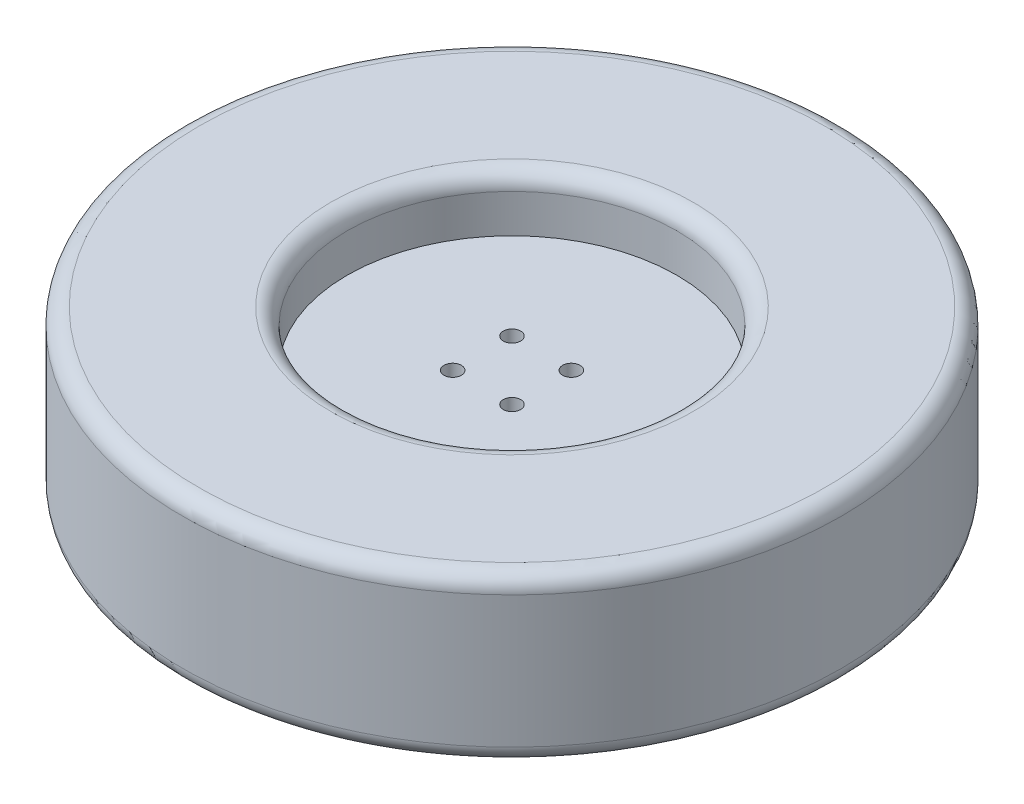
ISO-10303-21;
HEADER;
FILE_DESCRIPTION(('STEP AP214'),'2;1');
FILE_NAME('part.step','',(''),(''),'','','');
FILE_SCHEMA(('AUTOMOTIVE_DESIGN { 1 0 10303 214 1 1 1 1 }'));
ENDSEC;
DATA;
#1=APPLICATION_CONTEXT('core data for automotive mechanical design processes');
#2=APPLICATION_PROTOCOL_DEFINITION('international standard','automotive_design',2000,#1);
#3=PRODUCT_CONTEXT('',#1,'mechanical');
#4=PRODUCT('Part','Part','',(#3));
#5=PRODUCT_RELATED_PRODUCT_CATEGORY('part','',(#4));
#6=PRODUCT_DEFINITION_FORMATION('','',#4);
#7=PRODUCT_DEFINITION_CONTEXT('part definition',#1,'design');
#8=PRODUCT_DEFINITION('design','',#6,#7);
#9=PRODUCT_DEFINITION_SHAPE('','',#8);
#10=(LENGTH_UNIT() NAMED_UNIT(*) SI_UNIT(.MILLI.,.METRE.));
#11=(NAMED_UNIT(*) PLANE_ANGLE_UNIT() SI_UNIT($,.RADIAN.));
#12=(NAMED_UNIT(*) SI_UNIT($,.STERADIAN.) SOLID_ANGLE_UNIT());
#13=UNCERTAINTY_MEASURE_WITH_UNIT(LENGTH_MEASURE(1.E-05),#10,'distance_accuracy_value','');
#14=(GEOMETRIC_REPRESENTATION_CONTEXT(3) GLOBAL_UNCERTAINTY_ASSIGNED_CONTEXT((#13)) GLOBAL_UNIT_ASSIGNED_CONTEXT((#10,
#11,#12)) REPRESENTATION_CONTEXT('',''));
#15=CARTESIAN_POINT('',(0.,0.,0.));
#16=DIRECTION('',(0.,0.,1.));
#17=DIRECTION('',(1.,0.,0.));
#18=AXIS2_PLACEMENT_3D('',#15,#16,#17);
#19=CARTESIAN_POINT('',(0.,6.35,0.));
#20=DIRECTION('',(0.,1.,0.));
#21=DIRECTION('',(-1.,0.,0.));
#22=AXIS2_PLACEMENT_3D('',#19,#20,#21);
#23=CYLINDRICAL_SURFACE('',#22,38.1);
#24=CARTESIAN_POINT('',(0.,15.24,0.));
#25=DIRECTION('',(0.,1.,0.));
#26=DIRECTION('',(-1.,0.,0.));
#27=AXIS2_PLACEMENT_3D('',#24,#25,#26);
#28=CIRCLE('',#27,38.1);
#29=CARTESIAN_POINT('',(-38.1,15.24,0.));
#30=VERTEX_POINT('',#29);
#31=EDGE_CURVE('E64',#30,#30,#28,.T.);
#32=ORIENTED_EDGE('',*,*,#31,.T.);
#33=EDGE_LOOP('',(#32));
#34=FACE_BOUND('',#33,.T.);
#35=CARTESIAN_POINT('',(0.,6.35000000000001,0.));
#36=DIRECTION('',(0.,1.,0.));
#37=DIRECTION('',(-1.,0.,0.));
#38=AXIS2_PLACEMENT_3D('',#35,#36,#37);
#39=CIRCLE('',#38,38.1);
#40=CARTESIAN_POINT('',(-38.1,6.35,0.));
#41=VERTEX_POINT('',#40);
#42=EDGE_CURVE('E84',#41,#41,#39,.T.);
#43=ORIENTED_EDGE('',*,*,#42,.F.);
#44=EDGE_LOOP('',(#43));
#45=FACE_BOUND('',#44,.T.);
#46=ADVANCED_FACE('F40',(#34,#45),#23,.F.);
#47=CARTESIAN_POINT('',(-38.1,19.05,0.));
#48=DIRECTION('',(0.,1.,0.));
#49=DIRECTION('',(-1.,0.,0.));
#50=AXIS2_PLACEMENT_3D('',#47,#48,#49);
#51=PLANE('',#50);
#52=CARTESIAN_POINT('',(0.,19.05,0.));
#53=DIRECTION('',(0.,1.,0.));
#54=DIRECTION('',(-1.,0.,0.));
#55=AXIS2_PLACEMENT_3D('',#52,#53,#54);
#56=CIRCLE('',#55,41.91);
#57=CARTESIAN_POINT('',(-41.91,19.05,0.));
#58=VERTEX_POINT('',#57);
#59=EDGE_CURVE('E53',#58,#58,#56,.F.);
#60=ORIENTED_EDGE('',*,*,#59,.T.);
#61=EDGE_LOOP('',(#60));
#62=FACE_BOUND('',#61,.T.);
#63=CARTESIAN_POINT('',(0.,19.05,0.));
#64=DIRECTION('',(0.,1.,0.));
#65=DIRECTION('',(-1.,0.,0.));
#66=AXIS2_PLACEMENT_3D('',#63,#64,#65);
#67=CIRCLE('',#66,72.39);
#68=CARTESIAN_POINT('',(-72.39,19.05,0.));
#69=VERTEX_POINT('',#68);
#70=EDGE_CURVE('E58',#69,#69,#67,.T.);
#71=ORIENTED_EDGE('',*,*,#70,.T.);
#72=EDGE_LOOP('',(#71));
#73=FACE_BOUND('',#72,.T.);
#74=ADVANCED_FACE('F135',(#62,#73),#51,.T.);
#75=CARTESIAN_POINT('',(0.,6.35,0.));
#76=DIRECTION('',(0.,1.,0.));
#77=DIRECTION('',(-1.,0.,0.));
#78=AXIS2_PLACEMENT_3D('',#75,#76,#77);
#79=CYLINDRICAL_SURFACE('',#78,76.2);
#80=CARTESIAN_POINT('',(0.,-15.24,0.));
#81=DIRECTION('',(0.,-1.,0.));
#82=DIRECTION('',(1.,0.,0.));
#83=AXIS2_PLACEMENT_3D('',#80,#81,#82);
#84=CIRCLE('',#83,76.2);
#85=CARTESIAN_POINT('',(76.2,-15.24,0.));
#86=VERTEX_POINT('',#85);
#87=EDGE_CURVE('E10',#86,#86,#84,.F.);
#88=ORIENTED_EDGE('',*,*,#87,.T.);
#89=EDGE_LOOP('',(#88));
#90=FACE_BOUND('',#89,.T.);
#91=CARTESIAN_POINT('',(0.,15.24,0.));
#92=DIRECTION('',(0.,1.,0.));
#93=DIRECTION('',(-1.,0.,0.));
#94=AXIS2_PLACEMENT_3D('',#91,#92,#93);
#95=CIRCLE('',#94,76.2);
#96=CARTESIAN_POINT('',(-76.2,15.24,0.));
#97=VERTEX_POINT('',#96);
#98=EDGE_CURVE('E48',#97,#97,#95,.F.);
#99=ORIENTED_EDGE('',*,*,#98,.T.);
#100=EDGE_LOOP('',(#99));
#101=FACE_BOUND('',#100,.T.);
#102=ADVANCED_FACE('F141',(#90,#101),#79,.T.);
#103=CARTESIAN_POINT('',(-38.1,-19.05,0.));
#104=DIRECTION('',(0.,-1.,0.));
#105=DIRECTION('',(1.,0.,0.));
#106=AXIS2_PLACEMENT_3D('',#103,#104,#105);
#107=PLANE('',#106);
#108=CARTESIAN_POINT('',(0.,-19.05,0.));
#109=DIRECTION('',(0.,-1.,0.));
#110=DIRECTION('',(1.,0.,0.));
#111=AXIS2_PLACEMENT_3D('',#108,#109,#110);
#112=CIRCLE('',#111,41.91);
#113=CARTESIAN_POINT('',(41.91,-19.05,0.));
#114=VERTEX_POINT('',#113);
#115=EDGE_CURVE('E72',#114,#114,#112,.F.);
#116=ORIENTED_EDGE('',*,*,#115,.T.);
#117=EDGE_LOOP('',(#116));
#118=FACE_BOUND('',#117,.T.);
#119=CARTESIAN_POINT('',(0.,-19.05,0.));
#120=DIRECTION('',(0.,-1.,0.));
#121=DIRECTION('',(1.,0.,0.));
#122=AXIS2_PLACEMENT_3D('',#119,#120,#121);
#123=CIRCLE('',#122,72.39);
#124=CARTESIAN_POINT('',(72.39,-19.05,0.));
#125=VERTEX_POINT('',#124);
#126=EDGE_CURVE('E76',#125,#125,#123,.T.);
#127=ORIENTED_EDGE('',*,*,#126,.T.);
#128=EDGE_LOOP('',(#127));
#129=FACE_BOUND('',#128,.T.);
#130=ADVANCED_FACE('F163',(#118,#129),#107,.T.);
#131=CARTESIAN_POINT('',(0.,6.35,0.));
#132=DIRECTION('',(0.,1.,0.));
#133=DIRECTION('',(-1.,0.,0.));
#134=AXIS2_PLACEMENT_3D('',#131,#132,#133);
#135=CYLINDRICAL_SURFACE('',#134,38.1);
#136=CARTESIAN_POINT('',(0.,-15.24,0.));
#137=DIRECTION('',(0.,-1.,0.));
#138=DIRECTION('',(1.,0.,0.));
#139=AXIS2_PLACEMENT_3D('',#136,#137,#138);
#140=CIRCLE('',#139,38.1);
#141=CARTESIAN_POINT('',(38.1,-15.24,0.));
#142=VERTEX_POINT('',#141);
#143=EDGE_CURVE('E68',#142,#142,#140,.T.);
#144=ORIENTED_EDGE('',*,*,#143,.T.);
#145=EDGE_LOOP('',(#144));
#146=FACE_BOUND('',#145,.T.);
#147=CARTESIAN_POINT('',(0.,-6.34999999999999,0.));
#148=DIRECTION('',(0.,1.,0.));
#149=DIRECTION('',(-1.,0.,0.));
#150=AXIS2_PLACEMENT_3D('',#147,#148,#149);
#151=CIRCLE('',#150,38.1);
#152=CARTESIAN_POINT('',(-38.1,-6.35000000000001,0.));
#153=VERTEX_POINT('',#152);
#154=EDGE_CURVE('E80',#153,#153,#151,.T.);
#155=ORIENTED_EDGE('',*,*,#154,.T.);
#156=EDGE_LOOP('',(#155));
#157=FACE_BOUND('',#156,.T.);
#158=ADVANCED_FACE('F165',(#146,#157),#135,.F.);
#159=CARTESIAN_POINT('',(0.,-6.35,0.));
#160=DIRECTION('',(0.,-1.,0.));
#161=DIRECTION('',(1.,0.,0.));
#162=AXIS2_PLACEMENT_3D('',#159,#160,#161);
#163=PLANE('',#162);
#164=CARTESIAN_POINT('',(-6.858,-6.35,6.858));
#165=DIRECTION('',(0.,1.,0.));
#166=DIRECTION('',(-1.,0.,0.));
#167=AXIS2_PLACEMENT_3D('',#164,#165,#166);
#168=CIRCLE('',#167,2.0066);
#169=CARTESIAN_POINT('',(-8.8646,-6.35,6.858));
#170=VERTEX_POINT('',#169);
#171=EDGE_CURVE('E97',#170,#170,#168,.T.);
#172=ORIENTED_EDGE('',*,*,#171,.T.);
#173=EDGE_LOOP('',(#172));
#174=FACE_BOUND('',#173,.T.);
#175=CARTESIAN_POINT('',(6.858,-6.35,6.858));
#176=DIRECTION('',(0.,1.,0.));
#177=DIRECTION('',(-1.,0.,0.));
#178=AXIS2_PLACEMENT_3D('',#175,#176,#177);
#179=CIRCLE('',#178,2.0066);
#180=CARTESIAN_POINT('',(4.8514,-6.35,6.858));
#181=VERTEX_POINT('',#180);
#182=EDGE_CURVE('E105',#181,#181,#179,.T.);
#183=ORIENTED_EDGE('',*,*,#182,.T.);
#184=EDGE_LOOP('',(#183));
#185=FACE_BOUND('',#184,.T.);
#186=CARTESIAN_POINT('',(6.858,-6.35,-6.858));
#187=DIRECTION('',(0.,1.,0.));
#188=DIRECTION('',(-1.,0.,0.));
#189=AXIS2_PLACEMENT_3D('',#186,#187,#188);
#190=CIRCLE('',#189,2.0066);
#191=CARTESIAN_POINT('',(4.8514,-6.35,-6.858));
#192=VERTEX_POINT('',#191);
#193=EDGE_CURVE('E113',#192,#192,#190,.T.);
#194=ORIENTED_EDGE('',*,*,#193,.T.);
#195=EDGE_LOOP('',(#194));
#196=FACE_BOUND('',#195,.T.);
#197=CARTESIAN_POINT('',(-6.858,-6.35,-6.858));
#198=DIRECTION('',(0.,1.,0.));
#199=DIRECTION('',(-1.,0.,0.));
#200=AXIS2_PLACEMENT_3D('',#197,#198,#199);
#201=CIRCLE('',#200,2.0066);
#202=CARTESIAN_POINT('',(-8.8646,-6.35,-6.858));
#203=VERTEX_POINT('',#202);
#204=EDGE_CURVE('E88',#203,#203,#201,.T.);
#205=ORIENTED_EDGE('',*,*,#204,.T.);
#206=EDGE_LOOP('',(#205));
#207=FACE_BOUND('',#206,.T.);
#208=ORIENTED_EDGE('',*,*,#154,.F.);
#209=EDGE_LOOP('',(#208));
#210=FACE_BOUND('',#209,.T.);
#211=ADVANCED_FACE('F127',(#174,#185,#196,#207,#210),#163,.T.);
#212=CARTESIAN_POINT('',(0.,6.35,0.));
#213=DIRECTION('',(0.,1.,0.));
#214=DIRECTION('',(-1.,0.,0.));
#215=AXIS2_PLACEMENT_3D('',#212,#213,#214);
#216=PLANE('',#215);
#217=CARTESIAN_POINT('',(-6.858,6.35,6.858));
#218=DIRECTION('',(0.,1.,0.));
#219=DIRECTION('',(-1.,0.,0.));
#220=AXIS2_PLACEMENT_3D('',#217,#218,#219);
#221=CIRCLE('',#220,2.0066);
#222=CARTESIAN_POINT('',(-8.8646,6.35,6.858));
#223=VERTEX_POINT('',#222);
#224=EDGE_CURVE('E101',#223,#223,#221,.T.);
#225=ORIENTED_EDGE('',*,*,#224,.F.);
#226=EDGE_LOOP('',(#225));
#227=FACE_BOUND('',#226,.T.);
#228=CARTESIAN_POINT('',(6.858,6.35000000000001,6.858));
#229=DIRECTION('',(0.,1.,0.));
#230=DIRECTION('',(-1.,0.,0.));
#231=AXIS2_PLACEMENT_3D('',#228,#229,#230);
#232=CIRCLE('',#231,2.0066);
#233=CARTESIAN_POINT('',(4.8514,6.35,6.858));
#234=VERTEX_POINT('',#233);
#235=EDGE_CURVE('E109',#234,#234,#232,.T.);
#236=ORIENTED_EDGE('',*,*,#235,.F.);
#237=EDGE_LOOP('',(#236));
#238=FACE_BOUND('',#237,.T.);
#239=CARTESIAN_POINT('',(6.858,6.35000000000001,-6.858));
#240=DIRECTION('',(0.,1.,0.));
#241=DIRECTION('',(-1.,0.,0.));
#242=AXIS2_PLACEMENT_3D('',#239,#240,#241);
#243=CIRCLE('',#242,2.0066);
#244=CARTESIAN_POINT('',(4.8514,6.35,-6.858));
#245=VERTEX_POINT('',#244);
#246=EDGE_CURVE('E93',#245,#245,#243,.T.);
#247=ORIENTED_EDGE('',*,*,#246,.F.);
#248=EDGE_LOOP('',(#247));
#249=FACE_BOUND('',#248,.T.);
#250=CARTESIAN_POINT('',(-6.858,6.35,-6.858));
#251=DIRECTION('',(0.,1.,0.));
#252=DIRECTION('',(-1.,0.,0.));
#253=AXIS2_PLACEMENT_3D('',#250,#251,#252);
#254=CIRCLE('',#253,2.0066);
#255=CARTESIAN_POINT('',(-8.8646,6.35,-6.858));
#256=VERTEX_POINT('',#255);
#257=EDGE_CURVE('E89',#256,#256,#254,.T.);
#258=ORIENTED_EDGE('',*,*,#257,.F.);
#259=EDGE_LOOP('',(#258));
#260=FACE_BOUND('',#259,.T.);
#261=ORIENTED_EDGE('',*,*,#42,.T.);
#262=EDGE_LOOP('',(#261));
#263=FACE_BOUND('',#262,.T.);
#264=ADVANCED_FACE('F123',(#227,#238,#249,#260,#263),#216,.T.);
#265=CARTESIAN_POINT('',(0.,-15.24,0.));
#266=DIRECTION('',(0.,-1.,0.));
#267=DIRECTION('',(1.,0.,0.));
#268=AXIS2_PLACEMENT_3D('',#265,#266,#267);
#269=TOROIDAL_SURFACE('',#268,41.91,3.81);
#270=ORIENTED_EDGE('',*,*,#143,.F.);
#271=EDGE_LOOP('',(#270));
#272=FACE_BOUND('',#271,.T.);
#273=ORIENTED_EDGE('',*,*,#115,.F.);
#274=EDGE_LOOP('',(#273));
#275=FACE_BOUND('',#274,.T.);
#276=ADVANCED_FACE('F126',(#272,#275),#269,.T.);
#277=CARTESIAN_POINT('',(0.,15.24,0.));
#278=DIRECTION('',(0.,1.,0.));
#279=DIRECTION('',(-1.,0.,0.));
#280=AXIS2_PLACEMENT_3D('',#277,#278,#279);
#281=TOROIDAL_SURFACE('',#280,41.91,3.81);
#282=ORIENTED_EDGE('',*,*,#59,.F.);
#283=EDGE_LOOP('',(#282));
#284=FACE_BOUND('',#283,.T.);
#285=ORIENTED_EDGE('',*,*,#31,.F.);
#286=EDGE_LOOP('',(#285));
#287=FACE_BOUND('',#286,.T.);
#288=ADVANCED_FACE('F148',(#284,#287),#281,.T.);
#289=CARTESIAN_POINT('',(0.,-15.24,0.));
#290=DIRECTION('',(0.,-1.,0.));
#291=DIRECTION('',(1.,0.,0.));
#292=AXIS2_PLACEMENT_3D('',#289,#290,#291);
#293=TOROIDAL_SURFACE('',#292,72.39,3.81);
#294=ORIENTED_EDGE('',*,*,#126,.F.);
#295=EDGE_LOOP('',(#294));
#296=FACE_BOUND('',#295,.T.);
#297=ORIENTED_EDGE('',*,*,#87,.F.);
#298=EDGE_LOOP('',(#297));
#299=FACE_BOUND('',#298,.T.);
#300=ADVANCED_FACE('F151',(#296,#299),#293,.T.);
#301=CARTESIAN_POINT('',(0.,15.24,0.));
#302=DIRECTION('',(0.,1.,0.));
#303=DIRECTION('',(-1.,0.,0.));
#304=AXIS2_PLACEMENT_3D('',#301,#302,#303);
#305=TOROIDAL_SURFACE('',#304,72.39,3.81);
#306=ORIENTED_EDGE('',*,*,#98,.F.);
#307=EDGE_LOOP('',(#306));
#308=FACE_BOUND('',#307,.T.);
#309=ORIENTED_EDGE('',*,*,#70,.F.);
#310=EDGE_LOOP('',(#309));
#311=FACE_BOUND('',#310,.T.);
#312=ADVANCED_FACE('F42',(#308,#311),#305,.T.);
#313=CARTESIAN_POINT('',(-6.858,-6.35,-6.858));
#314=DIRECTION('',(0.,1.,0.));
#315=DIRECTION('',(-1.,0.,0.));
#316=AXIS2_PLACEMENT_3D('',#313,#314,#315);
#317=CYLINDRICAL_SURFACE('',#316,2.0066);
#318=CARTESIAN_POINT('',(-8.8646,-6.35,-6.858));
#319=CARTESIAN_POINT('',(-8.8646,-6.21770833333333,-6.858));
#320=CARTESIAN_POINT('',(-8.8646,-6.08541666666667,-6.858));
#321=CARTESIAN_POINT('',(-8.8646,-5.82083333333333,-6.858));
#322=CARTESIAN_POINT('',(-8.8646,-5.68854166666667,-6.858));
#323=CARTESIAN_POINT('',(-8.8646,-5.42395833333333,-6.858));
#324=CARTESIAN_POINT('',(-8.8646,-5.29166666666667,-6.858));
#325=CARTESIAN_POINT('',(-8.8646,-5.02708333333333,-6.858));
#326=CARTESIAN_POINT('',(-8.8646,-4.89479166666667,-6.858));
#327=CARTESIAN_POINT('',(-8.8646,-4.63020833333333,-6.858));
#328=CARTESIAN_POINT('',(-8.8646,-4.49791666666667,-6.858));
#329=CARTESIAN_POINT('',(-8.8646,-4.23333333333333,-6.858));
#330=CARTESIAN_POINT('',(-8.8646,-4.10104166666667,-6.858));
#331=CARTESIAN_POINT('',(-8.8646,-3.83645833333333,-6.858));
#332=CARTESIAN_POINT('',(-8.8646,-3.70416666666667,-6.858));
#333=CARTESIAN_POINT('',(-8.8646,-3.43958333333333,-6.858));
#334=CARTESIAN_POINT('',(-8.8646,-3.30729166666667,-6.858));
#335=CARTESIAN_POINT('',(-8.8646,-3.04270833333333,-6.858));
#336=CARTESIAN_POINT('',(-8.8646,-2.91041666666667,-6.858));
#337=CARTESIAN_POINT('',(-8.8646,-2.64583333333333,-6.858));
#338=CARTESIAN_POINT('',(-8.8646,-2.51354166666667,-6.858));
#339=CARTESIAN_POINT('',(-8.8646,-2.24895833333333,-6.858));
#340=CARTESIAN_POINT('',(-8.8646,-2.11666666666666,-6.858));
#341=CARTESIAN_POINT('',(-8.8646,-1.85208333333333,-6.858));
#342=CARTESIAN_POINT('',(-8.8646,-1.71979166666667,-6.858));
#343=CARTESIAN_POINT('',(-8.8646,-1.45520833333333,-6.858));
#344=CARTESIAN_POINT('',(-8.8646,-1.32291666666667,-6.858));
#345=CARTESIAN_POINT('',(-8.8646,-1.05833333333333,-6.858));
#346=CARTESIAN_POINT('',(-8.8646,-0.926041666666665,-6.858));
#347=CARTESIAN_POINT('',(-8.8646,-0.661458333333332,-6.858));
#348=CARTESIAN_POINT('',(-8.8646,-0.529166666666665,-6.858));
#349=CARTESIAN_POINT('',(-8.8646,-0.264583333333331,-6.858));
#350=CARTESIAN_POINT('',(-8.8646,-0.132291666666665,-6.858));
#351=CARTESIAN_POINT('',(-8.8646,0.132291666666668,-6.858));
#352=CARTESIAN_POINT('',(-8.8646,0.264583333333335,-6.858));
#353=CARTESIAN_POINT('',(-8.8646,0.529166666666668,-6.858));
#354=CARTESIAN_POINT('',(-8.8646,0.661458333333335,-6.858));
#355=CARTESIAN_POINT('',(-8.8646,0.926041666666669,-6.858));
#356=CARTESIAN_POINT('',(-8.8646,1.05833333333334,-6.858));
#357=CARTESIAN_POINT('',(-8.8646,1.32291666666667,-6.858));
#358=CARTESIAN_POINT('',(-8.8646,1.45520833333333,-6.858));
#359=CARTESIAN_POINT('',(-8.8646,1.71979166666667,-6.858));
#360=CARTESIAN_POINT('',(-8.8646,1.85208333333333,-6.858));
#361=CARTESIAN_POINT('',(-8.8646,2.11666666666667,-6.858));
#362=CARTESIAN_POINT('',(-8.8646,2.24895833333333,-6.858));
#363=CARTESIAN_POINT('',(-8.8646,2.51354166666667,-6.858));
#364=CARTESIAN_POINT('',(-8.8646,2.64583333333333,-6.858));
#365=CARTESIAN_POINT('',(-8.8646,2.91041666666667,-6.858));
#366=CARTESIAN_POINT('',(-8.8646,3.04270833333333,-6.858));
#367=CARTESIAN_POINT('',(-8.8646,3.30729166666667,-6.858));
#368=CARTESIAN_POINT('',(-8.8646,3.43958333333333,-6.858));
#369=CARTESIAN_POINT('',(-8.8646,3.70416666666667,-6.858));
#370=CARTESIAN_POINT('',(-8.8646,3.83645833333333,-6.858));
#371=CARTESIAN_POINT('',(-8.8646,4.10104166666667,-6.858));
#372=CARTESIAN_POINT('',(-8.8646,4.23333333333333,-6.858));
#373=CARTESIAN_POINT('',(-8.8646,4.49791666666667,-6.858));
#374=CARTESIAN_POINT('',(-8.8646,4.63020833333333,-6.858));
#375=CARTESIAN_POINT('',(-8.8646,4.89479166666667,-6.858));
#376=CARTESIAN_POINT('',(-8.8646,5.02708333333333,-6.858));
#377=CARTESIAN_POINT('',(-8.8646,5.29166666666667,-6.858));
#378=CARTESIAN_POINT('',(-8.8646,5.42395833333333,-6.858));
#379=CARTESIAN_POINT('',(-8.8646,5.68854166666667,-6.858));
#380=CARTESIAN_POINT('',(-8.8646,5.82083333333333,-6.858));
#381=CARTESIAN_POINT('',(-8.8646,6.08541666666667,-6.858));
#382=CARTESIAN_POINT('',(-8.8646,6.21770833333333,-6.858));
#383=CARTESIAN_POINT('',(-8.8646,6.35,-6.858));
#384=B_SPLINE_CURVE_WITH_KNOTS('',3,(#318,#319,#320,#321,#322,#323,#324,#325,#326,#327,#328,
#329,#330,#331,#332,#333,#334,#335,#336,#337,#338,#339,#340,#341,#342,#343,#344,#345,#346,#347,
#348,#349,#350,#351,#352,#353,#354,#355,#356,#357,#358,#359,#360,#361,#362,#363,#364,#365,#366,
#367,#368,#369,#370,#371,#372,#373,#374,#375,#376,#377,#378,#379,#380,#381,#382,#383),
.UNSPECIFIED.,.F.,.F.,(4,2,2,2,2,2,2,2,2,2,2,2,2,2,2,2,2,2,2,2,2,2,2,2,2,2,2,2,2,2,2,2,4),(0.,
0.396875,0.793749999999999,1.190625,1.5875,1.984375,2.38125,2.778125,3.175,3.571875,3.96875,
4.365625,4.7625,5.159375,5.55625,5.953125,6.35,6.746875,7.14375,7.540625,7.9375,8.334375,
8.73125,9.128125,9.525,9.921875,10.31875,10.715625,11.1125,11.509375,11.90625,12.303125,12.7),.UNSPECIFIED.);
#385=EDGE_CURVE('BSEAM158',#203,#256,#384,.T.);
#386=ORIENTED_EDGE('',*,*,#204,.F.);
#387=ORIENTED_EDGE('',*,*,#257,.T.);
#388=ORIENTED_EDGE('',*,*,#385,.T.);
#389=ORIENTED_EDGE('',*,*,#385,.F.);
#390=EDGE_LOOP('',(#386,#388,#387,#389));
#391=FACE_BOUND('',#390,.T.);
#392=ADVANCED_FACE('F158',(#391),#317,.F.);
#393=CARTESIAN_POINT('',(6.858,-6.35,-6.858));
#394=DIRECTION('',(0.,1.,0.));
#395=DIRECTION('',(-1.,0.,0.));
#396=AXIS2_PLACEMENT_3D('',#393,#394,#395);
#397=CYLINDRICAL_SURFACE('',#396,2.0066);
#398=CARTESIAN_POINT('',(4.8514,-6.35,-6.858));
#399=CARTESIAN_POINT('',(4.8514,-6.21770833333333,-6.858));
#400=CARTESIAN_POINT('',(4.8514,-6.08541666666666,-6.858));
#401=CARTESIAN_POINT('',(4.8514,-5.82083333333333,-6.858));
#402=CARTESIAN_POINT('',(4.8514,-5.68854166666666,-6.858));
#403=CARTESIAN_POINT('',(4.8514,-5.42395833333333,-6.858));
#404=CARTESIAN_POINT('',(4.8514,-5.29166666666666,-6.858));
#405=CARTESIAN_POINT('',(4.8514,-5.02708333333333,-6.858));
#406=CARTESIAN_POINT('',(4.8514,-4.89479166666666,-6.858));
#407=CARTESIAN_POINT('',(4.8514,-4.63020833333333,-6.858));
#408=CARTESIAN_POINT('',(4.8514,-4.49791666666666,-6.858));
#409=CARTESIAN_POINT('',(4.8514,-4.23333333333333,-6.858));
#410=CARTESIAN_POINT('',(4.8514,-4.10104166666666,-6.858));
#411=CARTESIAN_POINT('',(4.8514,-3.83645833333333,-6.858));
#412=CARTESIAN_POINT('',(4.8514,-3.70416666666666,-6.858));
#413=CARTESIAN_POINT('',(4.8514,-3.43958333333333,-6.858));
#414=CARTESIAN_POINT('',(4.8514,-3.30729166666666,-6.858));
#415=CARTESIAN_POINT('',(4.8514,-3.04270833333333,-6.858));
#416=CARTESIAN_POINT('',(4.8514,-2.91041666666666,-6.858));
#417=CARTESIAN_POINT('',(4.8514,-2.64583333333333,-6.858));
#418=CARTESIAN_POINT('',(4.8514,-2.51354166666666,-6.858));
#419=CARTESIAN_POINT('',(4.8514,-2.24895833333333,-6.858));
#420=CARTESIAN_POINT('',(4.8514,-2.11666666666666,-6.858));
#421=CARTESIAN_POINT('',(4.8514,-1.85208333333333,-6.858));
#422=CARTESIAN_POINT('',(4.8514,-1.71979166666666,-6.858));
#423=CARTESIAN_POINT('',(4.8514,-1.45520833333333,-6.858));
#424=CARTESIAN_POINT('',(4.8514,-1.32291666666666,-6.858));
#425=CARTESIAN_POINT('',(4.8514,-1.05833333333333,-6.858));
#426=CARTESIAN_POINT('',(4.8514,-0.926041666666662,-6.858));
#427=CARTESIAN_POINT('',(4.8514,-0.661458333333328,-6.858));
#428=CARTESIAN_POINT('',(4.8514,-0.529166666666661,-6.858));
#429=CARTESIAN_POINT('',(4.8514,-0.264583333333328,-6.858));
#430=CARTESIAN_POINT('',(4.8514,-0.132291666666661,-6.858));
#431=CARTESIAN_POINT('',(4.8514,0.132291666666672,-6.858));
#432=CARTESIAN_POINT('',(4.8514,0.264583333333338,-6.858));
#433=CARTESIAN_POINT('',(4.8514,0.529166666666672,-6.858));
#434=CARTESIAN_POINT('',(4.8514,0.661458333333339,-6.858));
#435=CARTESIAN_POINT('',(4.8514,0.926041666666672,-6.858));
#436=CARTESIAN_POINT('',(4.8514,1.05833333333334,-6.858));
#437=CARTESIAN_POINT('',(4.8514,1.32291666666667,-6.858));
#438=CARTESIAN_POINT('',(4.8514,1.45520833333334,-6.858));
#439=CARTESIAN_POINT('',(4.8514,1.71979166666667,-6.858));
#440=CARTESIAN_POINT('',(4.8514,1.85208333333334,-6.858));
#441=CARTESIAN_POINT('',(4.8514,2.11666666666667,-6.858));
#442=CARTESIAN_POINT('',(4.8514,2.24895833333334,-6.858));
#443=CARTESIAN_POINT('',(4.8514,2.51354166666667,-6.858));
#444=CARTESIAN_POINT('',(4.8514,2.64583333333334,-6.858));
#445=CARTESIAN_POINT('',(4.8514,2.91041666666667,-6.858));
#446=CARTESIAN_POINT('',(4.8514,3.04270833333334,-6.858));
#447=CARTESIAN_POINT('',(4.8514,3.30729166666667,-6.858));
#448=CARTESIAN_POINT('',(4.8514,3.43958333333334,-6.858));
#449=CARTESIAN_POINT('',(4.8514,3.70416666666667,-6.858));
#450=CARTESIAN_POINT('',(4.8514,3.83645833333334,-6.858));
#451=CARTESIAN_POINT('',(4.8514,4.10104166666667,-6.858));
#452=CARTESIAN_POINT('',(4.8514,4.23333333333334,-6.858));
#453=CARTESIAN_POINT('',(4.8514,4.49791666666667,-6.858));
#454=CARTESIAN_POINT('',(4.8514,4.63020833333334,-6.858));
#455=CARTESIAN_POINT('',(4.8514,4.89479166666667,-6.858));
#456=CARTESIAN_POINT('',(4.8514,5.02708333333334,-6.858));
#457=CARTESIAN_POINT('',(4.8514,5.29166666666667,-6.858));
#458=CARTESIAN_POINT('',(4.8514,5.42395833333334,-6.858));
#459=CARTESIAN_POINT('',(4.8514,5.68854166666667,-6.858));
#460=CARTESIAN_POINT('',(4.8514,5.82083333333334,-6.858));
#461=CARTESIAN_POINT('',(4.8514,6.08541666666667,-6.858));
#462=CARTESIAN_POINT('',(4.8514,6.21770833333334,-6.858));
#463=CARTESIAN_POINT('',(4.8514,6.35,-6.858));
#464=B_SPLINE_CURVE_WITH_KNOTS('',3,(#398,#399,#400,#401,#402,#403,#404,#405,#406,#407,#408,
#409,#410,#411,#412,#413,#414,#415,#416,#417,#418,#419,#420,#421,#422,#423,#424,#425,#426,#427,
#428,#429,#430,#431,#432,#433,#434,#435,#436,#437,#438,#439,#440,#441,#442,#443,#444,#445,#446,
#447,#448,#449,#450,#451,#452,#453,#454,#455,#456,#457,#458,#459,#460,#461,#462,#463),
.UNSPECIFIED.,.F.,.F.,(4,2,2,2,2,2,2,2,2,2,2,2,2,2,2,2,2,2,2,2,2,2,2,2,2,2,2,2,2,2,2,2,4),(0.,
0.396875,0.793749999999999,1.190625,1.5875,1.984375,2.38125,2.778125,3.175,3.571875,3.96875,
4.365625,4.7625,5.159375,5.55625,5.953125,6.35,6.746875,7.14375,7.540625,7.9375,8.334375,
8.73125,9.128125,9.525,9.921875,10.31875,10.715625,11.1125,11.509375,11.90625,12.303125,12.7),.UNSPECIFIED.);
#465=EDGE_CURVE('BSEAM121',#192,#245,#464,.T.);
#466=ORIENTED_EDGE('',*,*,#193,.F.);
#467=ORIENTED_EDGE('',*,*,#246,.T.);
#468=ORIENTED_EDGE('',*,*,#465,.T.);
#469=ORIENTED_EDGE('',*,*,#465,.F.);
#470=EDGE_LOOP('',(#466,#468,#467,#469));
#471=FACE_BOUND('',#470,.T.);
#472=ADVANCED_FACE('F121',(#471),#397,.F.);
#473=CARTESIAN_POINT('',(6.858,-6.35,6.858));
#474=DIRECTION('',(0.,1.,0.));
#475=DIRECTION('',(-1.,0.,0.));
#476=AXIS2_PLACEMENT_3D('',#473,#474,#475);
#477=CYLINDRICAL_SURFACE('',#476,2.0066);
#478=CARTESIAN_POINT('',(4.8514,-6.35,6.858));
#479=CARTESIAN_POINT('',(4.8514,-6.21770833333333,6.858));
#480=CARTESIAN_POINT('',(4.8514,-6.08541666666666,6.858));
#481=CARTESIAN_POINT('',(4.8514,-5.82083333333333,6.858));
#482=CARTESIAN_POINT('',(4.8514,-5.68854166666666,6.858));
#483=CARTESIAN_POINT('',(4.8514,-5.42395833333333,6.858));
#484=CARTESIAN_POINT('',(4.8514,-5.29166666666666,6.858));
#485=CARTESIAN_POINT('',(4.8514,-5.02708333333333,6.858));
#486=CARTESIAN_POINT('',(4.8514,-4.89479166666666,6.858));
#487=CARTESIAN_POINT('',(4.8514,-4.63020833333333,6.858));
#488=CARTESIAN_POINT('',(4.8514,-4.49791666666666,6.858));
#489=CARTESIAN_POINT('',(4.8514,-4.23333333333333,6.858));
#490=CARTESIAN_POINT('',(4.8514,-4.10104166666666,6.858));
#491=CARTESIAN_POINT('',(4.8514,-3.83645833333333,6.858));
#492=CARTESIAN_POINT('',(4.8514,-3.70416666666666,6.858));
#493=CARTESIAN_POINT('',(4.8514,-3.43958333333333,6.858));
#494=CARTESIAN_POINT('',(4.8514,-3.30729166666666,6.858));
#495=CARTESIAN_POINT('',(4.8514,-3.04270833333333,6.858));
#496=CARTESIAN_POINT('',(4.8514,-2.91041666666666,6.858));
#497=CARTESIAN_POINT('',(4.8514,-2.64583333333333,6.858));
#498=CARTESIAN_POINT('',(4.8514,-2.51354166666666,6.858));
#499=CARTESIAN_POINT('',(4.8514,-2.24895833333333,6.858));
#500=CARTESIAN_POINT('',(4.8514,-2.11666666666666,6.858));
#501=CARTESIAN_POINT('',(4.8514,-1.85208333333333,6.858));
#502=CARTESIAN_POINT('',(4.8514,-1.71979166666666,6.858));
#503=CARTESIAN_POINT('',(4.8514,-1.45520833333333,6.858));
#504=CARTESIAN_POINT('',(4.8514,-1.32291666666666,6.858));
#505=CARTESIAN_POINT('',(4.8514,-1.05833333333333,6.858));
#506=CARTESIAN_POINT('',(4.8514,-0.926041666666662,6.858));
#507=CARTESIAN_POINT('',(4.8514,-0.661458333333328,6.858));
#508=CARTESIAN_POINT('',(4.8514,-0.529166666666661,6.858));
#509=CARTESIAN_POINT('',(4.8514,-0.264583333333328,6.858));
#510=CARTESIAN_POINT('',(4.8514,-0.132291666666661,6.858));
#511=CARTESIAN_POINT('',(4.8514,0.132291666666672,6.858));
#512=CARTESIAN_POINT('',(4.8514,0.264583333333338,6.858));
#513=CARTESIAN_POINT('',(4.8514,0.529166666666672,6.858));
#514=CARTESIAN_POINT('',(4.8514,0.661458333333339,6.858));
#515=CARTESIAN_POINT('',(4.8514,0.926041666666672,6.858));
#516=CARTESIAN_POINT('',(4.8514,1.05833333333334,6.858));
#517=CARTESIAN_POINT('',(4.8514,1.32291666666667,6.858));
#518=CARTESIAN_POINT('',(4.8514,1.45520833333334,6.858));
#519=CARTESIAN_POINT('',(4.8514,1.71979166666667,6.858));
#520=CARTESIAN_POINT('',(4.8514,1.85208333333334,6.858));
#521=CARTESIAN_POINT('',(4.8514,2.11666666666667,6.858));
#522=CARTESIAN_POINT('',(4.8514,2.24895833333334,6.858));
#523=CARTESIAN_POINT('',(4.8514,2.51354166666667,6.858));
#524=CARTESIAN_POINT('',(4.8514,2.64583333333334,6.858));
#525=CARTESIAN_POINT('',(4.8514,2.91041666666667,6.858));
#526=CARTESIAN_POINT('',(4.8514,3.04270833333334,6.858));
#527=CARTESIAN_POINT('',(4.8514,3.30729166666667,6.858));
#528=CARTESIAN_POINT('',(4.8514,3.43958333333334,6.858));
#529=CARTESIAN_POINT('',(4.8514,3.70416666666667,6.858));
#530=CARTESIAN_POINT('',(4.8514,3.83645833333334,6.858));
#531=CARTESIAN_POINT('',(4.8514,4.10104166666667,6.858));
#532=CARTESIAN_POINT('',(4.8514,4.23333333333334,6.858));
#533=CARTESIAN_POINT('',(4.8514,4.49791666666667,6.858));
#534=CARTESIAN_POINT('',(4.8514,4.63020833333334,6.858));
#535=CARTESIAN_POINT('',(4.8514,4.89479166666667,6.858));
#536=CARTESIAN_POINT('',(4.8514,5.02708333333334,6.858));
#537=CARTESIAN_POINT('',(4.8514,5.29166666666667,6.858));
#538=CARTESIAN_POINT('',(4.8514,5.42395833333334,6.858));
#539=CARTESIAN_POINT('',(4.8514,5.68854166666667,6.858));
#540=CARTESIAN_POINT('',(4.8514,5.82083333333334,6.858));
#541=CARTESIAN_POINT('',(4.8514,6.08541666666667,6.858));
#542=CARTESIAN_POINT('',(4.8514,6.21770833333334,6.858));
#543=CARTESIAN_POINT('',(4.8514,6.35,6.858));
#544=B_SPLINE_CURVE_WITH_KNOTS('',3,(#478,#479,#480,#481,#482,#483,#484,#485,#486,#487,#488,
#489,#490,#491,#492,#493,#494,#495,#496,#497,#498,#499,#500,#501,#502,#503,#504,#505,#506,#507,
#508,#509,#510,#511,#512,#513,#514,#515,#516,#517,#518,#519,#520,#521,#522,#523,#524,#525,#526,
#527,#528,#529,#530,#531,#532,#533,#534,#535,#536,#537,#538,#539,#540,#541,#542,#543),
.UNSPECIFIED.,.F.,.F.,(4,2,2,2,2,2,2,2,2,2,2,2,2,2,2,2,2,2,2,2,2,2,2,2,2,2,2,2,2,2,2,2,4),(0.,
0.396875,0.793749999999999,1.190625,1.5875,1.984375,2.38125,2.778125,3.175,3.571875,3.96875,
4.365625,4.7625,5.159375,5.55625,5.953125,6.35,6.746875,7.14375,7.540625,7.9375,8.334375,
8.73125,9.128125,9.525,9.921875,10.31875,10.715625,11.1125,11.509375,11.90625,12.303125,12.7),.UNSPECIFIED.);
#545=EDGE_CURVE('BSEAM184',#181,#234,#544,.T.);
#546=ORIENTED_EDGE('',*,*,#182,.F.);
#547=ORIENTED_EDGE('',*,*,#235,.T.);
#548=ORIENTED_EDGE('',*,*,#545,.T.);
#549=ORIENTED_EDGE('',*,*,#545,.F.);
#550=EDGE_LOOP('',(#546,#548,#547,#549));
#551=FACE_BOUND('',#550,.T.);
#552=ADVANCED_FACE('F184',(#551),#477,.F.);
#553=CARTESIAN_POINT('',(-6.858,-6.35,6.858));
#554=DIRECTION('',(0.,1.,0.));
#555=DIRECTION('',(-1.,0.,0.));
#556=AXIS2_PLACEMENT_3D('',#553,#554,#555);
#557=CYLINDRICAL_SURFACE('',#556,2.0066);
#558=CARTESIAN_POINT('',(-8.8646,-6.35,6.858));
#559=CARTESIAN_POINT('',(-8.8646,-6.21770833333333,6.858));
#560=CARTESIAN_POINT('',(-8.8646,-6.08541666666667,6.858));
#561=CARTESIAN_POINT('',(-8.8646,-5.82083333333333,6.858));
#562=CARTESIAN_POINT('',(-8.8646,-5.68854166666667,6.858));
#563=CARTESIAN_POINT('',(-8.8646,-5.42395833333333,6.858));
#564=CARTESIAN_POINT('',(-8.8646,-5.29166666666667,6.858));
#565=CARTESIAN_POINT('',(-8.8646,-5.02708333333333,6.858));
#566=CARTESIAN_POINT('',(-8.8646,-4.89479166666667,6.858));
#567=CARTESIAN_POINT('',(-8.8646,-4.63020833333333,6.858));
#568=CARTESIAN_POINT('',(-8.8646,-4.49791666666667,6.858));
#569=CARTESIAN_POINT('',(-8.8646,-4.23333333333333,6.858));
#570=CARTESIAN_POINT('',(-8.8646,-4.10104166666667,6.858));
#571=CARTESIAN_POINT('',(-8.8646,-3.83645833333333,6.858));
#572=CARTESIAN_POINT('',(-8.8646,-3.70416666666667,6.858));
#573=CARTESIAN_POINT('',(-8.8646,-3.43958333333333,6.858));
#574=CARTESIAN_POINT('',(-8.8646,-3.30729166666667,6.858));
#575=CARTESIAN_POINT('',(-8.8646,-3.04270833333333,6.858));
#576=CARTESIAN_POINT('',(-8.8646,-2.91041666666667,6.858));
#577=CARTESIAN_POINT('',(-8.8646,-2.64583333333333,6.858));
#578=CARTESIAN_POINT('',(-8.8646,-2.51354166666667,6.858));
#579=CARTESIAN_POINT('',(-8.8646,-2.24895833333333,6.858));
#580=CARTESIAN_POINT('',(-8.8646,-2.11666666666666,6.858));
#581=CARTESIAN_POINT('',(-8.8646,-1.85208333333333,6.858));
#582=CARTESIAN_POINT('',(-8.8646,-1.71979166666667,6.858));
#583=CARTESIAN_POINT('',(-8.8646,-1.45520833333333,6.858));
#584=CARTESIAN_POINT('',(-8.8646,-1.32291666666667,6.858));
#585=CARTESIAN_POINT('',(-8.8646,-1.05833333333333,6.858));
#586=CARTESIAN_POINT('',(-8.8646,-0.926041666666665,6.858));
#587=CARTESIAN_POINT('',(-8.8646,-0.661458333333332,6.858));
#588=CARTESIAN_POINT('',(-8.8646,-0.529166666666665,6.858));
#589=CARTESIAN_POINT('',(-8.8646,-0.264583333333331,6.858));
#590=CARTESIAN_POINT('',(-8.8646,-0.132291666666665,6.858));
#591=CARTESIAN_POINT('',(-8.8646,0.132291666666668,6.858));
#592=CARTESIAN_POINT('',(-8.8646,0.264583333333335,6.858));
#593=CARTESIAN_POINT('',(-8.8646,0.529166666666668,6.858));
#594=CARTESIAN_POINT('',(-8.8646,0.661458333333335,6.858));
#595=CARTESIAN_POINT('',(-8.8646,0.926041666666669,6.858));
#596=CARTESIAN_POINT('',(-8.8646,1.05833333333334,6.858));
#597=CARTESIAN_POINT('',(-8.8646,1.32291666666667,6.858));
#598=CARTESIAN_POINT('',(-8.8646,1.45520833333333,6.858));
#599=CARTESIAN_POINT('',(-8.8646,1.71979166666667,6.858));
#600=CARTESIAN_POINT('',(-8.8646,1.85208333333333,6.858));
#601=CARTESIAN_POINT('',(-8.8646,2.11666666666667,6.858));
#602=CARTESIAN_POINT('',(-8.8646,2.24895833333333,6.858));
#603=CARTESIAN_POINT('',(-8.8646,2.51354166666667,6.858));
#604=CARTESIAN_POINT('',(-8.8646,2.64583333333333,6.858));
#605=CARTESIAN_POINT('',(-8.8646,2.91041666666667,6.858));
#606=CARTESIAN_POINT('',(-8.8646,3.04270833333333,6.858));
#607=CARTESIAN_POINT('',(-8.8646,3.30729166666667,6.858));
#608=CARTESIAN_POINT('',(-8.8646,3.43958333333333,6.858));
#609=CARTESIAN_POINT('',(-8.8646,3.70416666666667,6.858));
#610=CARTESIAN_POINT('',(-8.8646,3.83645833333333,6.858));
#611=CARTESIAN_POINT('',(-8.8646,4.10104166666667,6.858));
#612=CARTESIAN_POINT('',(-8.8646,4.23333333333333,6.858));
#613=CARTESIAN_POINT('',(-8.8646,4.49791666666667,6.858));
#614=CARTESIAN_POINT('',(-8.8646,4.63020833333333,6.858));
#615=CARTESIAN_POINT('',(-8.8646,4.89479166666667,6.858));
#616=CARTESIAN_POINT('',(-8.8646,5.02708333333333,6.858));
#617=CARTESIAN_POINT('',(-8.8646,5.29166666666667,6.858));
#618=CARTESIAN_POINT('',(-8.8646,5.42395833333333,6.858));
#619=CARTESIAN_POINT('',(-8.8646,5.68854166666667,6.858));
#620=CARTESIAN_POINT('',(-8.8646,5.82083333333333,6.858));
#621=CARTESIAN_POINT('',(-8.8646,6.08541666666667,6.858));
#622=CARTESIAN_POINT('',(-8.8646,6.21770833333333,6.858));
#623=CARTESIAN_POINT('',(-8.8646,6.35,6.858));
#624=B_SPLINE_CURVE_WITH_KNOTS('',3,(#558,#559,#560,#561,#562,#563,#564,#565,#566,#567,#568,
#569,#570,#571,#572,#573,#574,#575,#576,#577,#578,#579,#580,#581,#582,#583,#584,#585,#586,#587,
#588,#589,#590,#591,#592,#593,#594,#595,#596,#597,#598,#599,#600,#601,#602,#603,#604,#605,#606,
#607,#608,#609,#610,#611,#612,#613,#614,#615,#616,#617,#618,#619,#620,#621,#622,#623),
.UNSPECIFIED.,.F.,.F.,(4,2,2,2,2,2,2,2,2,2,2,2,2,2,2,2,2,2,2,2,2,2,2,2,2,2,2,2,2,2,2,2,4),(0.,
0.396875,0.793749999999999,1.190625,1.5875,1.984375,2.38125,2.778125,3.175,3.571875,3.96875,
4.365625,4.7625,5.159375,5.55625,5.953125,6.35,6.746875,7.14375,7.540625,7.9375,8.334375,
8.73125,9.128125,9.525,9.921875,10.31875,10.715625,11.1125,11.509375,11.90625,12.303125,12.7),.UNSPECIFIED.);
#625=EDGE_CURVE('BSEAM181',#170,#223,#624,.T.);
#626=ORIENTED_EDGE('',*,*,#171,.F.);
#627=ORIENTED_EDGE('',*,*,#224,.T.);
#628=ORIENTED_EDGE('',*,*,#625,.T.);
#629=ORIENTED_EDGE('',*,*,#625,.F.);
#630=EDGE_LOOP('',(#626,#628,#627,#629));
#631=FACE_BOUND('',#630,.T.);
#632=ADVANCED_FACE('F181',(#631),#557,.F.);
#633=CLOSED_SHELL('',(#46,#74,#102,#130,#158,#211,#264,#276,#288,#300,#312,#392,#472,#552,#632));
#634=MANIFOLD_SOLID_BREP('B2',#633);
#635=ADVANCED_BREP_SHAPE_REPRESENTATION('',(#18,#634),#14);
#636=SHAPE_DEFINITION_REPRESENTATION(#9,#635);
ENDSEC;
END-ISO-10303-21;
